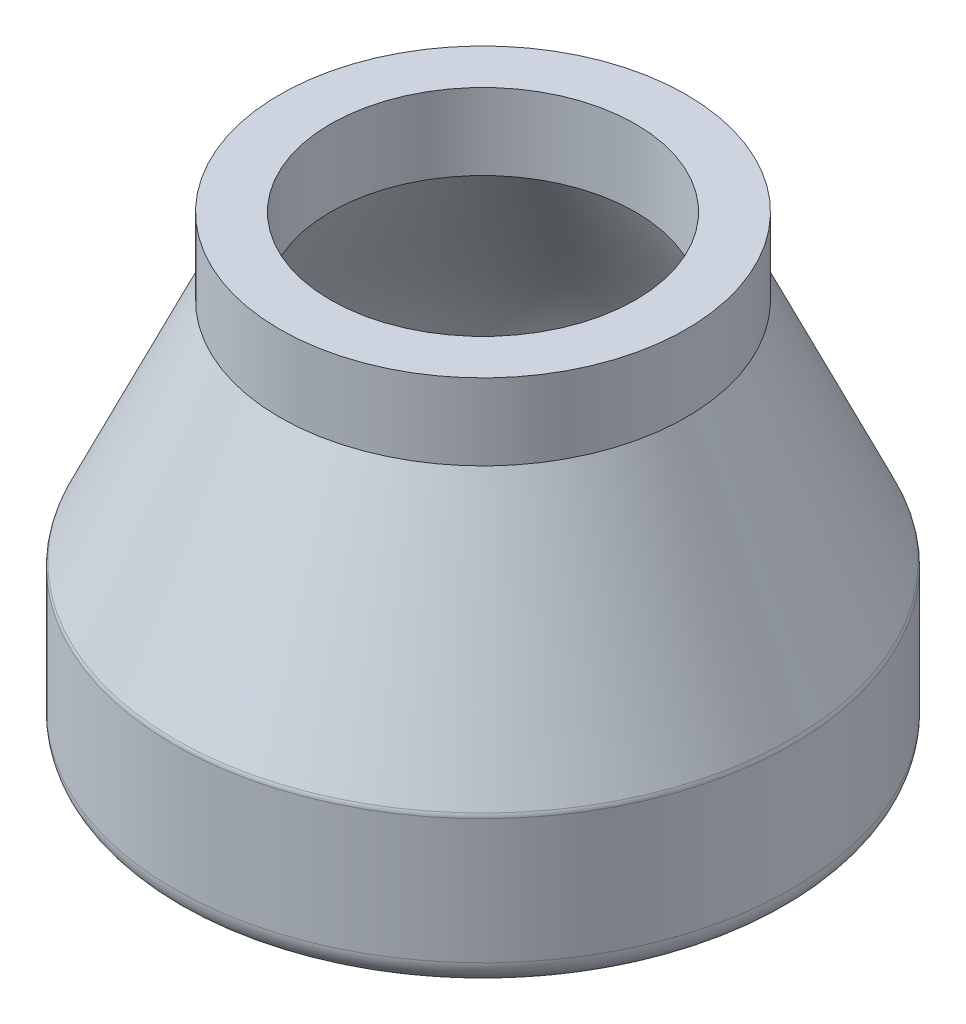
ISO-10303-21;
HEADER;
FILE_DESCRIPTION(('STEP AP214'),'2;1');
FILE_NAME('part.step','',(''),(''),'','','');
FILE_SCHEMA(('AUTOMOTIVE_DESIGN { 1 0 10303 214 1 1 1 1 }'));
ENDSEC;
DATA;
#1=APPLICATION_CONTEXT('core data for automotive mechanical design processes');
#2=APPLICATION_PROTOCOL_DEFINITION('international standard','automotive_design',2000,#1);
#3=PRODUCT_CONTEXT('',#1,'mechanical');
#4=PRODUCT('Part','Part','',(#3));
#5=PRODUCT_RELATED_PRODUCT_CATEGORY('part','',(#4));
#6=PRODUCT_DEFINITION_FORMATION('','',#4);
#7=PRODUCT_DEFINITION_CONTEXT('part definition',#1,'design');
#8=PRODUCT_DEFINITION('design','',#6,#7);
#9=PRODUCT_DEFINITION_SHAPE('','',#8);
#10=(LENGTH_UNIT() NAMED_UNIT(*) SI_UNIT(.MILLI.,.METRE.));
#11=(NAMED_UNIT(*) PLANE_ANGLE_UNIT() SI_UNIT($,.RADIAN.));
#12=(NAMED_UNIT(*) SI_UNIT($,.STERADIAN.) SOLID_ANGLE_UNIT());
#13=UNCERTAINTY_MEASURE_WITH_UNIT(LENGTH_MEASURE(1.E-05),#10,'distance_accuracy_value','');
#14=(GEOMETRIC_REPRESENTATION_CONTEXT(3) GLOBAL_UNCERTAINTY_ASSIGNED_CONTEXT((#13)) GLOBAL_UNIT_ASSIGNED_CONTEXT((#10,
#11,#12)) REPRESENTATION_CONTEXT('',''));
#15=CARTESIAN_POINT('',(0.,0.,0.));
#16=DIRECTION('',(0.,0.,1.));
#17=DIRECTION('',(1.,0.,0.));
#18=AXIS2_PLACEMENT_3D('',#15,#16,#17);
#19=CARTESIAN_POINT('',(0.,0.,0.));
#20=DIRECTION('',(0.,1.,0.));
#21=DIRECTION('',(0.,0.,1.));
#22=AXIS2_PLACEMENT_3D('',#19,#20,#21);
#23=PLANE('',#22);
#24=CARTESIAN_POINT('',(0.,0.,0.));
#25=DIRECTION('',(0.,1.,0.));
#26=DIRECTION('',(0.,0.,1.));
#27=AXIS2_PLACEMENT_3D('',#24,#25,#26);
#28=CIRCLE('',#27,11.15);
#29=CARTESIAN_POINT('',(0.,0.,11.15));
#30=VERTEX_POINT('',#29);
#31=EDGE_CURVE('E61',#30,#30,#28,.F.);
#32=ORIENTED_EDGE('',*,*,#31,.T.);
#33=EDGE_LOOP('',(#32));
#34=FACE_BOUND('',#33,.T.);
#35=CARTESIAN_POINT('',(0.,0.,0.));
#36=DIRECTION('',(0.,1.,0.));
#37=DIRECTION('',(0.,0.,1.));
#38=AXIS2_PLACEMENT_3D('',#35,#36,#37);
#39=CIRCLE('',#38,10.15);
#40=CARTESIAN_POINT('',(0.,0.,10.15));
#41=VERTEX_POINT('',#40);
#42=EDGE_CURVE('E67',#41,#41,#39,.T.);
#43=ORIENTED_EDGE('',*,*,#42,.T.);
#44=EDGE_LOOP('',(#43));
#45=FACE_BOUND('',#44,.T.);
#46=ADVANCED_FACE('F41',(#34,#45),#23,.F.);
#47=CARTESIAN_POINT('',(0.,6.,0.));
#48=DIRECTION('',(0.,-1.,0.));
#49=DIRECTION('',(0.,0.,-1.));
#50=AXIS2_PLACEMENT_3D('',#47,#48,#49);
#51=CYLINDRICAL_SURFACE('',#50,12.15);
#52=CARTESIAN_POINT('',(0.,5.91221913135238,0.));
#53=DIRECTION('',(0.,-1.,0.));
#54=DIRECTION('',(0.,0.,-1.));
#55=AXIS2_PLACEMENT_3D('',#52,#53,#54);
#56=CIRCLE('',#55,12.15);
#57=CARTESIAN_POINT('',(0.,5.91221913135238,-12.15));
#58=VERTEX_POINT('',#57);
#59=EDGE_CURVE('E11',#58,#58,#56,.T.);
#60=ORIENTED_EDGE('',*,*,#59,.T.);
#61=EDGE_LOOP('',(#60));
#62=FACE_BOUND('',#61,.T.);
#63=CARTESIAN_POINT('',(0.,1.,0.));
#64=DIRECTION('',(0.,1.,0.));
#65=DIRECTION('',(0.,0.,1.));
#66=AXIS2_PLACEMENT_3D('',#63,#64,#65);
#67=CIRCLE('',#66,12.15);
#68=CARTESIAN_POINT('',(0.,1.,12.15));
#69=VERTEX_POINT('',#68);
#70=EDGE_CURVE('E64',#69,#69,#67,.T.);
#71=ORIENTED_EDGE('',*,*,#70,.T.);
#72=EDGE_LOOP('',(#71));
#73=FACE_BOUND('',#72,.T.);
#74=ADVANCED_FACE('F97',(#62,#73),#51,.T.);
#75=CARTESIAN_POINT('',(0.,1.,0.));
#76=DIRECTION('',(0.,1.,0.));
#77=DIRECTION('',(0.,0.,1.));
#78=AXIS2_PLACEMENT_3D('',#75,#76,#77);
#79=TOROIDAL_SURFACE('',#78,11.15,1.);
#80=ORIENTED_EDGE('',*,*,#31,.F.);
#81=EDGE_LOOP('',(#80));
#82=FACE_BOUND('',#81,.T.);
#83=ORIENTED_EDGE('',*,*,#70,.F.);
#84=EDGE_LOOP('',(#83));
#85=FACE_BOUND('',#84,.T.);
#86=ADVANCED_FACE('F93',(#82,#85),#79,.T.);
#87=CARTESIAN_POINT('',(0.,0.,0.));
#88=DIRECTION('',(0.,1.,0.));
#89=DIRECTION('',(0.,0.,1.));
#90=AXIS2_PLACEMENT_3D('',#87,#88,#89);
#91=CONICAL_SURFACE('',#90,10.15,0.0416425790985882);
#92=CARTESIAN_POINT('',(0.,5.94633582074441,0.));
#93=DIRECTION('',(0.,1.,0.));
#94=DIRECTION('',(0.,0.,1.));
#95=AXIS2_PLACEMENT_3D('',#92,#93,#94);
#96=CIRCLE('',#95,10.397763992531);
#97=CARTESIAN_POINT('',(0.,5.94633582074441,10.397763992531));
#98=VERTEX_POINT('',#97);
#99=EDGE_CURVE('E56',#98,#98,#96,.T.);
#100=ORIENTED_EDGE('',*,*,#99,.T.);
#101=EDGE_LOOP('',(#100));
#102=FACE_BOUND('',#101,.T.);
#103=ORIENTED_EDGE('',*,*,#42,.F.);
#104=EDGE_LOOP('',(#103));
#105=FACE_BOUND('',#104,.T.);
#106=ADVANCED_FACE('F88',(#102,#105),#91,.F.);
#107=CARTESIAN_POINT('',(0.,6.,-10.4));
#108=CARTESIAN_POINT('',(0.,8.73897815357147,-9.77749023187482));
#109=CARTESIAN_POINT('',(0.,10.4234139728518,-8.57528413833826));
#110=CARTESIAN_POINT('',(0.,15.,-5.99999999999999));
#111=B_SPLINE_CURVE_WITH_KNOTS('',3,(#107,#108,#109,#110),.UNSPECIFIED.,.F.,.F.,(4,4),(0.,1.),.UNSPECIFIED.);
#112=CARTESIAN_POINT('',(0.,15.,0.));
#113=DIRECTION('',(0.,1.,0.));
#114=AXIS1_PLACEMENT('',#112,#113);
#115=SURFACE_OF_REVOLUTION('',#111,#114);
#116=CARTESIAN_POINT('',(0.,6.05308021238213,0.));
#117=DIRECTION('',(0.,1.,0.));
#118=DIRECTION('',(0.,0.,1.));
#119=AXIS2_PLACEMENT_3D('',#116,#117,#118);
#120=CIRCLE('',#119,10.3878329723462);
#121=CARTESIAN_POINT('',(0.,6.05308021238213,10.3878329723462));
#122=VERTEX_POINT('',#121);
#123=EDGE_CURVE('E52',#122,#122,#120,.F.);
#124=ORIENTED_EDGE('',*,*,#123,.T.);
#125=EDGE_LOOP('',(#124));
#126=FACE_BOUND('',#125,.T.);
#127=CARTESIAN_POINT('',(0.,15.,0.));
#128=DIRECTION('',(0.,1.,0.));
#129=DIRECTION('',(0.,0.,1.));
#130=AXIS2_PLACEMENT_3D('',#127,#128,#129);
#131=CIRCLE('',#130,6.);
#132=CARTESIAN_POINT('',(0.,15.,6.));
#133=VERTEX_POINT('',#132);
#134=EDGE_CURVE('E121',#133,#133,#131,.T.);
#135=ORIENTED_EDGE('',*,*,#134,.T.);
#136=EDGE_LOOP('',(#135));
#137=FACE_BOUND('',#136,.T.);
#138=ADVANCED_FACE('F83',(#126,#137),#115,.F.);
#139=CARTESIAN_POINT('',(0.,6.,0.));
#140=DIRECTION('',(0.,-1.,0.));
#141=DIRECTION('',(0.,0.,-1.));
#142=AXIS2_PLACEMENT_3D('',#139,#140,#141);
#143=CONICAL_SURFACE('',#142,12.15,0.432055414767644);
#144=CARTESIAN_POINT('',(0.,6.07971442021474,0.));
#145=DIRECTION('',(0.,1.,0.));
#146=DIRECTION('',(0.,0.,1.));
#147=AXIS2_PLACEMENT_3D('',#144,#145,#146);
#148=CIRCLE('',#147,12.1132427951232);
#149=CARTESIAN_POINT('',(0.,6.07971442021474,12.1132427951232));
#150=VERTEX_POINT('',#149);
#151=EDGE_CURVE('E48',#150,#150,#148,.T.);
#152=ORIENTED_EDGE('',*,*,#151,.T.);
#153=EDGE_LOOP('',(#152));
#154=FACE_BOUND('',#153,.T.);
#155=CARTESIAN_POINT('',(0.,15.,0.));
#156=DIRECTION('',(0.,1.,0.));
#157=DIRECTION('',(0.,0.,1.));
#158=AXIS2_PLACEMENT_3D('',#155,#156,#157);
#159=CIRCLE('',#158,8.);
#160=CARTESIAN_POINT('',(0.,15.,8.));
#161=VERTEX_POINT('',#160);
#162=EDGE_CURVE('E70',#161,#161,#159,.T.);
#163=ORIENTED_EDGE('',*,*,#162,.F.);
#164=EDGE_LOOP('',(#163));
#165=FACE_BOUND('',#164,.T.);
#166=ADVANCED_FACE('F87',(#154,#165),#143,.T.);
#167=CARTESIAN_POINT('',(0.,5.96298803862928,0.));
#168=DIRECTION('',(0.,1.,0.));
#169=DIRECTION('',(0.,0.,1.));
#170=AXIS2_PLACEMENT_3D('',#167,#168,#169);
#171=TOROIDAL_SURFACE('',#170,9.99811076329408,0.4);
#172=ORIENTED_EDGE('',*,*,#123,.F.);
#173=EDGE_LOOP('',(#172));
#174=FACE_BOUND('',#173,.T.);
#175=ORIENTED_EDGE('',*,*,#99,.F.);
#176=EDGE_LOOP('',(#175));
#177=FACE_BOUND('',#176,.T.);
#178=ADVANCED_FACE('F103',(#174,#177),#171,.F.);
#179=CARTESIAN_POINT('',(0.,5.91221913135238,0.));
#180=DIRECTION('',(0.,-1.,0.));
#181=DIRECTION('',(0.,0.,-1.));
#182=AXIS2_PLACEMENT_3D('',#179,#180,#181);
#183=TOROIDAL_SURFACE('',#182,11.75,0.4);
#184=ORIENTED_EDGE('',*,*,#59,.F.);
#185=EDGE_LOOP('',(#184));
#186=FACE_BOUND('',#185,.T.);
#187=ORIENTED_EDGE('',*,*,#151,.F.);
#188=EDGE_LOOP('',(#187));
#189=FACE_BOUND('',#188,.T.);
#190=ADVANCED_FACE('F43',(#186,#189),#183,.T.);
#191=CARTESIAN_POINT('',(0.,18.,0.));
#192=DIRECTION('',(0.,1.,0.));
#193=DIRECTION('',(0.,0.,1.));
#194=AXIS2_PLACEMENT_3D('',#191,#192,#193);
#195=PLANE('',#194);
#196=CARTESIAN_POINT('',(0.,18.,0.));
#197=DIRECTION('',(0.,1.,0.));
#198=DIRECTION('',(0.,0.,1.));
#199=AXIS2_PLACEMENT_3D('',#196,#197,#198);
#200=CIRCLE('',#199,8.);
#201=CARTESIAN_POINT('',(0.,18.,8.00000000000001));
#202=VERTEX_POINT('',#201);
#203=EDGE_CURVE('E73',#202,#202,#200,.T.);
#204=ORIENTED_EDGE('',*,*,#203,.T.);
#205=EDGE_LOOP('',(#204));
#206=FACE_BOUND('',#205,.T.);
#207=CARTESIAN_POINT('',(0.,18.,0.));
#208=DIRECTION('',(0.,1.,0.));
#209=DIRECTION('',(0.,0.,1.));
#210=AXIS2_PLACEMENT_3D('',#207,#208,#209);
#211=CIRCLE('',#210,6.);
#212=CARTESIAN_POINT('',(0.,18.,6.));
#213=VERTEX_POINT('',#212);
#214=EDGE_CURVE('E123',#213,#213,#211,.T.);
#215=ORIENTED_EDGE('',*,*,#214,.F.);
#216=EDGE_LOOP('',(#215));
#217=FACE_BOUND('',#216,.T.);
#218=ADVANCED_FACE('F110',(#206,#217),#195,.T.);
#219=CARTESIAN_POINT('',(0.,18.,0.));
#220=DIRECTION('',(0.,-1.,0.));
#221=DIRECTION('',(0.,0.,-1.));
#222=AXIS2_PLACEMENT_3D('',#219,#220,#221);
#223=CYLINDRICAL_SURFACE('',#222,8.);
#224=ORIENTED_EDGE('',*,*,#203,.F.);
#225=EDGE_LOOP('',(#224));
#226=FACE_BOUND('',#225,.T.);
#227=ORIENTED_EDGE('',*,*,#162,.T.);
#228=EDGE_LOOP('',(#227));
#229=FACE_BOUND('',#228,.T.);
#230=ADVANCED_FACE('F133',(#226,#229),#223,.T.);
#231=CARTESIAN_POINT('',(0.,18.,0.));
#232=DIRECTION('',(0.,-1.,0.));
#233=DIRECTION('',(0.,0.,-1.));
#234=AXIS2_PLACEMENT_3D('',#231,#232,#233);
#235=CYLINDRICAL_SURFACE('',#234,6.);
#236=ORIENTED_EDGE('',*,*,#214,.T.);
#237=EDGE_LOOP('',(#236));
#238=FACE_BOUND('',#237,.T.);
#239=ORIENTED_EDGE('',*,*,#134,.F.);
#240=EDGE_LOOP('',(#239));
#241=FACE_BOUND('',#240,.T.);
#242=ADVANCED_FACE('F136',(#238,#241),#235,.F.);
#243=CLOSED_SHELL('',(#46,#74,#86,#106,#138,#166,#178,#190,#218,#230,#242));
#244=MANIFOLD_SOLID_BREP('B2',#243);
#245=ADVANCED_BREP_SHAPE_REPRESENTATION('',(#18,#244),#14);
#246=SHAPE_DEFINITION_REPRESENTATION(#9,#245);
ENDSEC;
END-ISO-10303-21;
